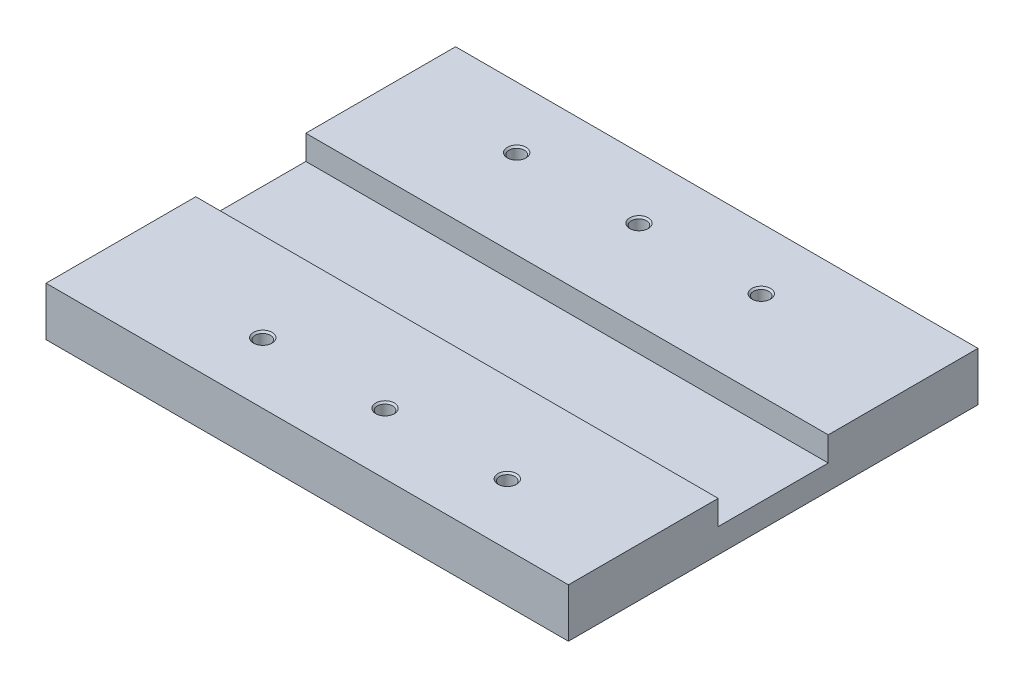
ISO-10303-21;
HEADER;
FILE_DESCRIPTION(('STEP AP214'),'2;1');
FILE_NAME('part.step','',(''),(''),'','','');
FILE_SCHEMA(('AUTOMOTIVE_DESIGN { 1 0 10303 214 1 1 1 1 }'));
ENDSEC;
DATA;
#1=APPLICATION_CONTEXT('core data for automotive mechanical design processes');
#2=APPLICATION_PROTOCOL_DEFINITION('international standard','automotive_design',2000,#1);
#3=PRODUCT_CONTEXT('',#1,'mechanical');
#4=PRODUCT('Part','Part','',(#3));
#5=PRODUCT_RELATED_PRODUCT_CATEGORY('part','',(#4));
#6=PRODUCT_DEFINITION_FORMATION('','',#4);
#7=PRODUCT_DEFINITION_CONTEXT('part definition',#1,'design');
#8=PRODUCT_DEFINITION('design','',#6,#7);
#9=PRODUCT_DEFINITION_SHAPE('','',#8);
#10=(LENGTH_UNIT() NAMED_UNIT(*) SI_UNIT(.MILLI.,.METRE.));
#11=(NAMED_UNIT(*) PLANE_ANGLE_UNIT() SI_UNIT($,.RADIAN.));
#12=(NAMED_UNIT(*) SI_UNIT($,.STERADIAN.) SOLID_ANGLE_UNIT());
#13=UNCERTAINTY_MEASURE_WITH_UNIT(LENGTH_MEASURE(1.E-05),#10,'distance_accuracy_value','');
#14=(GEOMETRIC_REPRESENTATION_CONTEXT(3) GLOBAL_UNCERTAINTY_ASSIGNED_CONTEXT((#13)) GLOBAL_UNIT_ASSIGNED_CONTEXT((#10,
#11,#12)) REPRESENTATION_CONTEXT('',''));
#15=CARTESIAN_POINT('',(0.,0.,0.));
#16=DIRECTION('',(0.,0.,1.));
#17=DIRECTION('',(1.,0.,0.));
#18=AXIS2_PLACEMENT_3D('',#15,#16,#17);
#19=CARTESIAN_POINT('',(104.54,12.,-153.432212943892));
#20=DIRECTION('',(1.,0.,0.));
#21=DIRECTION('',(0.,0.,-1.));
#22=AXIS2_PLACEMENT_3D('',#19,#20,#21);
#23=PLANE('',#22);
#24=DIRECTION('',(0.,0.,-1.));
#25=VECTOR('',#24,1.);
#26=CARTESIAN_POINT('',(104.54,4.,-153.432212943892));
#27=LINE('',#26,#25);
#28=CARTESIAN_POINT('',(104.54,4.,-86.4322129438916));
#29=VERTEX_POINT('',#28);
#30=CARTESIAN_POINT('',(104.54,4.,-153.432212943892));
#31=VERTEX_POINT('',#30);
#32=EDGE_CURVE('E51',#29,#31,#27,.T.);
#33=ORIENTED_EDGE('',*,*,#32,.F.);
#34=DIRECTION('',(0.,-1.,0.));
#35=VECTOR('',#34,1.);
#36=CARTESIAN_POINT('',(104.54,12.,-86.4322129438916));
#37=LINE('',#36,#35);
#38=CARTESIAN_POINT('',(104.54,12.,-86.4322129438916));
#39=VERTEX_POINT('',#38);
#40=EDGE_CURVE('E11',#39,#29,#37,.T.);
#41=ORIENTED_EDGE('',*,*,#40,.F.);
#42=DIRECTION('',(0.,0.,1.));
#43=VECTOR('',#42,1.);
#44=CARTESIAN_POINT('',(104.54,12.,-153.432212943892));
#45=LINE('',#44,#43);
#46=CARTESIAN_POINT('',(104.54,12.,-110.932212943892));
#47=VERTEX_POINT('',#46);
#48=EDGE_CURVE('E137',#47,#39,#45,.T.);
#49=ORIENTED_EDGE('',*,*,#48,.F.);
#50=DIRECTION('',(0.,-1.,0.));
#51=VECTOR('',#50,1.);
#52=CARTESIAN_POINT('',(104.54,12.,-110.932212943892));
#53=LINE('',#52,#51);
#54=CARTESIAN_POINT('',(104.54,8.,-110.932212943892));
#55=VERTEX_POINT('',#54);
#56=EDGE_CURVE('E148',#47,#55,#53,.T.);
#57=ORIENTED_EDGE('',*,*,#56,.T.);
#58=DIRECTION('',(0.,0.,-1.));
#59=VECTOR('',#58,1.);
#60=CARTESIAN_POINT('',(104.54,8.,-110.932212943892));
#61=LINE('',#60,#59);
#62=CARTESIAN_POINT('',(104.54,8.,-128.932212943892));
#63=VERTEX_POINT('',#62);
#64=EDGE_CURVE('E158',#55,#63,#61,.T.);
#65=ORIENTED_EDGE('',*,*,#64,.T.);
#66=DIRECTION('',(0.,1.,0.));
#67=VECTOR('',#66,1.);
#68=CARTESIAN_POINT('',(104.54,12.,-128.932212943892));
#69=LINE('',#68,#67);
#70=CARTESIAN_POINT('',(104.54,12.,-128.932212943892));
#71=VERTEX_POINT('',#70);
#72=EDGE_CURVE('E141',#63,#71,#69,.T.);
#73=ORIENTED_EDGE('',*,*,#72,.T.);
#74=CARTESIAN_POINT('',(104.54,12.,-153.432212943892));
#75=VERTEX_POINT('',#74);
#76=EDGE_CURVE('E134',#75,#71,#45,.T.);
#77=ORIENTED_EDGE('',*,*,#76,.F.);
#78=DIRECTION('',(0.,-1.,0.));
#79=VECTOR('',#78,1.);
#80=CARTESIAN_POINT('',(104.54,12.,-153.432212943892));
#81=LINE('',#80,#79);
#82=EDGE_CURVE('E122',#75,#31,#81,.T.);
#83=ORIENTED_EDGE('',*,*,#82,.T.);
#84=EDGE_LOOP('',(#33,#41,#49,#57,#65,#73,#77,#83));
#85=FACE_BOUND('',#84,.T.);
#86=ADVANCED_FACE('F36',(#85),#23,.F.);
#87=CARTESIAN_POINT('',(104.54,12.,-86.4322129438916));
#88=DIRECTION('',(0.,0.,-1.));
#89=DIRECTION('',(-1.,0.,0.));
#90=AXIS2_PLACEMENT_3D('',#87,#88,#89);
#91=PLANE('',#90);
#92=DIRECTION('',(-1.,0.,0.));
#93=VECTOR('',#92,1.);
#94=CARTESIAN_POINT('',(104.54,4.,-86.4322129438916));
#95=LINE('',#94,#93);
#96=CARTESIAN_POINT('',(190.,4.,-86.4322129438916));
#97=VERTEX_POINT('',#96);
#98=EDGE_CURVE('E118',#97,#29,#95,.T.);
#99=ORIENTED_EDGE('',*,*,#98,.F.);
#100=DIRECTION('',(0.,-1.,0.));
#101=VECTOR('',#100,1.);
#102=CARTESIAN_POINT('',(190.,12.,-86.4322129438916));
#103=LINE('',#102,#101);
#104=CARTESIAN_POINT('',(190.,12.,-86.4322129438916));
#105=VERTEX_POINT('',#104);
#106=EDGE_CURVE('E44',#105,#97,#103,.T.);
#107=ORIENTED_EDGE('',*,*,#106,.F.);
#108=DIRECTION('',(1.,0.,0.));
#109=VECTOR('',#108,1.);
#110=CARTESIAN_POINT('',(104.54,12.,-86.4322129438916));
#111=LINE('',#110,#109);
#112=EDGE_CURVE('E132',#39,#105,#111,.T.);
#113=ORIENTED_EDGE('',*,*,#112,.F.);
#114=ORIENTED_EDGE('',*,*,#40,.T.);
#115=EDGE_LOOP('',(#99,#107,#113,#114));
#116=FACE_BOUND('',#115,.T.);
#117=ADVANCED_FACE('F238',(#116),#91,.F.);
#118=CARTESIAN_POINT('',(190.,12.,-86.4322129438916));
#119=DIRECTION('',(-1.,0.,0.));
#120=DIRECTION('',(0.,0.,1.));
#121=AXIS2_PLACEMENT_3D('',#118,#119,#120);
#122=PLANE('',#121);
#123=DIRECTION('',(0.,0.,1.));
#124=VECTOR('',#123,1.);
#125=CARTESIAN_POINT('',(190.,4.,-86.4322129438916));
#126=LINE('',#125,#124);
#127=CARTESIAN_POINT('',(190.,4.,-153.432212943892));
#128=VERTEX_POINT('',#127);
#129=EDGE_CURVE('E101',#128,#97,#126,.T.);
#130=ORIENTED_EDGE('',*,*,#129,.F.);
#131=DIRECTION('',(0.,-1.,0.));
#132=VECTOR('',#131,1.);
#133=CARTESIAN_POINT('',(190.,12.,-153.432212943892));
#134=LINE('',#133,#132);
#135=CARTESIAN_POINT('',(190.,12.,-153.432212943892));
#136=VERTEX_POINT('',#135);
#137=EDGE_CURVE('E114',#136,#128,#134,.T.);
#138=ORIENTED_EDGE('',*,*,#137,.F.);
#139=DIRECTION('',(0.,0.,-1.));
#140=VECTOR('',#139,1.);
#141=CARTESIAN_POINT('',(190.,12.,-86.4322129438916));
#142=LINE('',#141,#140);
#143=CARTESIAN_POINT('',(190.,12.,-128.932212943892));
#144=VERTEX_POINT('',#143);
#145=EDGE_CURVE('E131',#144,#136,#142,.T.);
#146=ORIENTED_EDGE('',*,*,#145,.F.);
#147=DIRECTION('',(0.,1.,0.));
#148=VECTOR('',#147,1.);
#149=CARTESIAN_POINT('',(190.,12.,-128.932212943892));
#150=LINE('',#149,#148);
#151=CARTESIAN_POINT('',(190.,8.,-128.932212943892));
#152=VERTEX_POINT('',#151);
#153=EDGE_CURVE('E59',#152,#144,#150,.T.);
#154=ORIENTED_EDGE('',*,*,#153,.F.);
#155=DIRECTION('',(0.,0.,-1.));
#156=VECTOR('',#155,1.);
#157=CARTESIAN_POINT('',(190.,8.,-110.932212943892));
#158=LINE('',#157,#156);
#159=CARTESIAN_POINT('',(190.,8.,-110.932212943892));
#160=VERTEX_POINT('',#159);
#161=EDGE_CURVE('E149',#160,#152,#158,.T.);
#162=ORIENTED_EDGE('',*,*,#161,.F.);
#163=DIRECTION('',(0.,-1.,0.));
#164=VECTOR('',#163,1.);
#165=CARTESIAN_POINT('',(190.,12.,-110.932212943892));
#166=LINE('',#165,#164);
#167=CARTESIAN_POINT('',(190.,12.,-110.932212943892));
#168=VERTEX_POINT('',#167);
#169=EDGE_CURVE('E152',#168,#160,#166,.T.);
#170=ORIENTED_EDGE('',*,*,#169,.F.);
#171=EDGE_CURVE('E128',#105,#168,#142,.T.);
#172=ORIENTED_EDGE('',*,*,#171,.F.);
#173=ORIENTED_EDGE('',*,*,#106,.T.);
#174=EDGE_LOOP('',(#130,#138,#146,#154,#162,#170,#172,#173));
#175=FACE_BOUND('',#174,.T.);
#176=ADVANCED_FACE('F112',(#175),#122,.F.);
#177=CARTESIAN_POINT('',(190.,12.,-153.432212943892));
#178=DIRECTION('',(0.,0.,1.));
#179=DIRECTION('',(1.,0.,0.));
#180=AXIS2_PLACEMENT_3D('',#177,#178,#179);
#181=PLANE('',#180);
#182=DIRECTION('',(1.,0.,0.));
#183=VECTOR('',#182,1.);
#184=CARTESIAN_POINT('',(190.,4.,-153.432212943892));
#185=LINE('',#184,#183);
#186=EDGE_CURVE('E98',#31,#128,#185,.T.);
#187=ORIENTED_EDGE('',*,*,#186,.F.);
#188=ORIENTED_EDGE('',*,*,#82,.F.);
#189=DIRECTION('',(-1.,0.,0.));
#190=VECTOR('',#189,1.);
#191=CARTESIAN_POINT('',(190.,12.,-153.432212943892));
#192=LINE('',#191,#190);
#193=EDGE_CURVE('E121',#136,#75,#192,.T.);
#194=ORIENTED_EDGE('',*,*,#193,.F.);
#195=ORIENTED_EDGE('',*,*,#137,.T.);
#196=EDGE_LOOP('',(#187,#188,#194,#195));
#197=FACE_BOUND('',#196,.T.);
#198=ADVANCED_FACE('F120',(#197),#181,.F.);
#199=CARTESIAN_POINT('',(124.54,12.,-143.432212943892));
#200=DIRECTION('',(0.,1.,0.));
#201=DIRECTION('',(0.,0.,1.));
#202=AXIS2_PLACEMENT_3D('',#199,#200,#201);
#203=CYLINDRICAL_SURFACE('',#202,1.25);
#204=CARTESIAN_POINT('',(124.54,11.725,-143.432212943892));
#205=DIRECTION('',(0.,1.,0.));
#206=DIRECTION('',(0.,0.,1.));
#207=AXIS2_PLACEMENT_3D('',#204,#205,#206);
#208=CIRCLE('',#207,1.25);
#209=CARTESIAN_POINT('',(124.54,11.725,-142.182212943892));
#210=VERTEX_POINT('',#209);
#211=EDGE_CURVE('E155',#210,#210,#208,.T.);
#212=ORIENTED_EDGE('',*,*,#211,.T.);
#213=EDGE_LOOP('',(#212));
#214=FACE_BOUND('',#213,.T.);
#215=CARTESIAN_POINT('',(124.54,4.,-143.432212943892));
#216=DIRECTION('',(0.,-1.,0.));
#217=DIRECTION('',(0.,0.,-1.));
#218=AXIS2_PLACEMENT_3D('',#215,#216,#217);
#219=CIRCLE('',#218,1.25);
#220=CARTESIAN_POINT('',(124.54,4.,-144.682212943892));
#221=VERTEX_POINT('',#220);
#222=EDGE_CURVE('E107',#221,#221,#219,.F.);
#223=ORIENTED_EDGE('',*,*,#222,.F.);
#224=EDGE_LOOP('',(#223));
#225=FACE_BOUND('',#224,.T.);
#226=ADVANCED_FACE('F272',(#214,#225),#203,.F.);
#227=CARTESIAN_POINT('',(144.54,12.,-143.432212943892));
#228=DIRECTION('',(0.,1.,0.));
#229=DIRECTION('',(0.,0.,1.));
#230=AXIS2_PLACEMENT_3D('',#227,#228,#229);
#231=CYLINDRICAL_SURFACE('',#230,1.25);
#232=CARTESIAN_POINT('',(144.54,11.725,-143.432212943892));
#233=DIRECTION('',(0.,1.,0.));
#234=DIRECTION('',(0.,0.,1.));
#235=AXIS2_PLACEMENT_3D('',#232,#233,#234);
#236=CIRCLE('',#235,1.25);
#237=CARTESIAN_POINT('',(144.54,11.725,-142.182212943892));
#238=VERTEX_POINT('',#237);
#239=EDGE_CURVE('E168',#238,#238,#236,.T.);
#240=ORIENTED_EDGE('',*,*,#239,.T.);
#241=EDGE_LOOP('',(#240));
#242=FACE_BOUND('',#241,.T.);
#243=CARTESIAN_POINT('',(144.54,4.,-143.432212943892));
#244=DIRECTION('',(0.,-1.,0.));
#245=DIRECTION('',(0.,0.,-1.));
#246=AXIS2_PLACEMENT_3D('',#243,#244,#245);
#247=CIRCLE('',#246,1.25);
#248=CARTESIAN_POINT('',(144.54,4.,-144.682212943892));
#249=VERTEX_POINT('',#248);
#250=EDGE_CURVE('E202',#249,#249,#247,.F.);
#251=ORIENTED_EDGE('',*,*,#250,.F.);
#252=EDGE_LOOP('',(#251));
#253=FACE_BOUND('',#252,.T.);
#254=ADVANCED_FACE('F288',(#242,#253),#231,.F.);
#255=CARTESIAN_POINT('',(164.54,12.,-143.432212943892));
#256=DIRECTION('',(0.,1.,0.));
#257=DIRECTION('',(0.,0.,1.));
#258=AXIS2_PLACEMENT_3D('',#255,#256,#257);
#259=CYLINDRICAL_SURFACE('',#258,1.25);
#260=CARTESIAN_POINT('',(164.54,11.725,-143.432212943892));
#261=DIRECTION('',(0.,1.,0.));
#262=DIRECTION('',(0.,0.,1.));
#263=AXIS2_PLACEMENT_3D('',#260,#261,#262);
#264=CIRCLE('',#263,1.25);
#265=CARTESIAN_POINT('',(164.54,11.725,-142.182212943892));
#266=VERTEX_POINT('',#265);
#267=EDGE_CURVE('E174',#266,#266,#264,.T.);
#268=ORIENTED_EDGE('',*,*,#267,.T.);
#269=EDGE_LOOP('',(#268));
#270=FACE_BOUND('',#269,.T.);
#271=CARTESIAN_POINT('',(164.54,4.,-143.432212943892));
#272=DIRECTION('',(0.,-1.,0.));
#273=DIRECTION('',(0.,0.,-1.));
#274=AXIS2_PLACEMENT_3D('',#271,#272,#273);
#275=CIRCLE('',#274,1.25);
#276=CARTESIAN_POINT('',(164.54,4.,-144.682212943892));
#277=VERTEX_POINT('',#276);
#278=EDGE_CURVE('E205',#277,#277,#275,.F.);
#279=ORIENTED_EDGE('',*,*,#278,.F.);
#280=EDGE_LOOP('',(#279));
#281=FACE_BOUND('',#280,.T.);
#282=ADVANCED_FACE('F296',(#270,#281),#259,.F.);
#283=CARTESIAN_POINT('',(130.,12.,-96.4322129438916));
#284=DIRECTION('',(0.,1.,0.));
#285=DIRECTION('',(0.,0.,1.));
#286=AXIS2_PLACEMENT_3D('',#283,#284,#285);
#287=CYLINDRICAL_SURFACE('',#286,1.25);
#288=CARTESIAN_POINT('',(130.,11.725,-96.4322129438916));
#289=DIRECTION('',(0.,1.,0.));
#290=DIRECTION('',(0.,0.,1.));
#291=AXIS2_PLACEMENT_3D('',#288,#289,#290);
#292=CIRCLE('',#291,1.25);
#293=CARTESIAN_POINT('',(130.,11.725,-95.1822129438916));
#294=VERTEX_POINT('',#293);
#295=EDGE_CURVE('E180',#294,#294,#292,.T.);
#296=ORIENTED_EDGE('',*,*,#295,.T.);
#297=EDGE_LOOP('',(#296));
#298=FACE_BOUND('',#297,.T.);
#299=CARTESIAN_POINT('',(130.,4.,-96.4322129438916));
#300=DIRECTION('',(0.,-1.,0.));
#301=DIRECTION('',(0.,0.,-1.));
#302=AXIS2_PLACEMENT_3D('',#299,#300,#301);
#303=CIRCLE('',#302,1.25);
#304=CARTESIAN_POINT('',(130.,4.,-97.6822129438916));
#305=VERTEX_POINT('',#304);
#306=EDGE_CURVE('E208',#305,#305,#303,.F.);
#307=ORIENTED_EDGE('',*,*,#306,.F.);
#308=EDGE_LOOP('',(#307));
#309=FACE_BOUND('',#308,.T.);
#310=ADVANCED_FACE('F232',(#298,#309),#287,.F.);
#311=CARTESIAN_POINT('',(150.,12.,-96.4322129438916));
#312=DIRECTION('',(0.,1.,0.));
#313=DIRECTION('',(0.,0.,1.));
#314=AXIS2_PLACEMENT_3D('',#311,#312,#313);
#315=CYLINDRICAL_SURFACE('',#314,1.25);
#316=CARTESIAN_POINT('',(150.,11.725,-96.4322129438916));
#317=DIRECTION('',(0.,1.,0.));
#318=DIRECTION('',(0.,0.,1.));
#319=AXIS2_PLACEMENT_3D('',#316,#317,#318);
#320=CIRCLE('',#319,1.25);
#321=CARTESIAN_POINT('',(150.,11.725,-95.1822129438916));
#322=VERTEX_POINT('',#321);
#323=EDGE_CURVE('E186',#322,#322,#320,.T.);
#324=ORIENTED_EDGE('',*,*,#323,.T.);
#325=EDGE_LOOP('',(#324));
#326=FACE_BOUND('',#325,.T.);
#327=CARTESIAN_POINT('',(150.,4.,-96.4322129438916));
#328=DIRECTION('',(0.,-1.,0.));
#329=DIRECTION('',(0.,0.,-1.));
#330=AXIS2_PLACEMENT_3D('',#327,#328,#329);
#331=CIRCLE('',#330,1.25);
#332=CARTESIAN_POINT('',(150.,4.,-97.6822129438916));
#333=VERTEX_POINT('',#332);
#334=EDGE_CURVE('E211',#333,#333,#331,.F.);
#335=ORIENTED_EDGE('',*,*,#334,.F.);
#336=EDGE_LOOP('',(#335));
#337=FACE_BOUND('',#336,.T.);
#338=ADVANCED_FACE('F222',(#326,#337),#315,.F.);
#339=CARTESIAN_POINT('',(170.,12.,-96.4322129438916));
#340=DIRECTION('',(0.,1.,0.));
#341=DIRECTION('',(0.,0.,1.));
#342=AXIS2_PLACEMENT_3D('',#339,#340,#341);
#343=CYLINDRICAL_SURFACE('',#342,1.25);
#344=CARTESIAN_POINT('',(170.,11.725,-96.4322129438916));
#345=DIRECTION('',(0.,1.,0.));
#346=DIRECTION('',(0.,0.,1.));
#347=AXIS2_PLACEMENT_3D('',#344,#345,#346);
#348=CIRCLE('',#347,1.25);
#349=CARTESIAN_POINT('',(170.,11.725,-95.1822129438916));
#350=VERTEX_POINT('',#349);
#351=EDGE_CURVE('E192',#350,#350,#348,.T.);
#352=ORIENTED_EDGE('',*,*,#351,.T.);
#353=EDGE_LOOP('',(#352));
#354=FACE_BOUND('',#353,.T.);
#355=CARTESIAN_POINT('',(170.,4.,-96.4322129438916));
#356=DIRECTION('',(0.,-1.,0.));
#357=DIRECTION('',(0.,0.,-1.));
#358=AXIS2_PLACEMENT_3D('',#355,#356,#357);
#359=CIRCLE('',#358,1.25);
#360=CARTESIAN_POINT('',(170.,4.,-97.6822129438916));
#361=VERTEX_POINT('',#360);
#362=EDGE_CURVE('E39',#361,#361,#359,.F.);
#363=ORIENTED_EDGE('',*,*,#362,.F.);
#364=EDGE_LOOP('',(#363));
#365=FACE_BOUND('',#364,.T.);
#366=ADVANCED_FACE('F219',(#354,#365),#343,.F.);
#367=CARTESIAN_POINT('',(0.,12.,0.));
#368=DIRECTION('',(0.,1.,0.));
#369=DIRECTION('',(0.,0.,1.));
#370=AXIS2_PLACEMENT_3D('',#367,#368,#369);
#371=PLANE('',#370);
#372=CARTESIAN_POINT('',(170.,12.,-96.4322129438916));
#373=DIRECTION('',(0.,1.,0.));
#374=DIRECTION('',(0.,0.,1.));
#375=AXIS2_PLACEMENT_3D('',#372,#373,#374);
#376=CIRCLE('',#375,1.525);
#377=CARTESIAN_POINT('',(170.,12.,-94.9072129438916));
#378=VERTEX_POINT('',#377);
#379=EDGE_CURVE('E195',#378,#378,#376,.T.);
#380=ORIENTED_EDGE('',*,*,#379,.F.);
#381=EDGE_LOOP('',(#380));
#382=FACE_BOUND('',#381,.T.);
#383=CARTESIAN_POINT('',(150.,12.,-96.4322129438916));
#384=DIRECTION('',(0.,1.,0.));
#385=DIRECTION('',(0.,0.,1.));
#386=AXIS2_PLACEMENT_3D('',#383,#384,#385);
#387=CIRCLE('',#386,1.525);
#388=CARTESIAN_POINT('',(150.,12.,-94.9072129438916));
#389=VERTEX_POINT('',#388);
#390=EDGE_CURVE('E189',#389,#389,#387,.T.);
#391=ORIENTED_EDGE('',*,*,#390,.F.);
#392=EDGE_LOOP('',(#391));
#393=FACE_BOUND('',#392,.T.);
#394=CARTESIAN_POINT('',(130.,12.,-96.4322129438916));
#395=DIRECTION('',(0.,1.,0.));
#396=DIRECTION('',(0.,0.,1.));
#397=AXIS2_PLACEMENT_3D('',#394,#395,#396);
#398=CIRCLE('',#397,1.525);
#399=CARTESIAN_POINT('',(130.,12.,-94.9072129438916));
#400=VERTEX_POINT('',#399);
#401=EDGE_CURVE('E183',#400,#400,#398,.T.);
#402=ORIENTED_EDGE('',*,*,#401,.F.);
#403=EDGE_LOOP('',(#402));
#404=FACE_BOUND('',#403,.T.);
#405=DIRECTION('',(1.,0.,0.));
#406=VECTOR('',#405,1.);
#407=CARTESIAN_POINT('',(104.54,12.,-110.932212943892));
#408=LINE('',#407,#406);
#409=EDGE_CURVE('E145',#47,#168,#408,.T.);
#410=ORIENTED_EDGE('',*,*,#409,.F.);
#411=ORIENTED_EDGE('',*,*,#48,.T.);
#412=ORIENTED_EDGE('',*,*,#112,.T.);
#413=ORIENTED_EDGE('',*,*,#171,.T.);
#414=EDGE_LOOP('',(#410,#411,#412,#413));
#415=FACE_BOUND('',#414,.T.);
#416=ADVANCED_FACE('F221',(#382,#393,#404,#415),#371,.T.);
#417=CARTESIAN_POINT('',(164.54,12.,-143.432212943892));
#418=DIRECTION('',(0.,1.,0.));
#419=DIRECTION('',(0.,0.,1.));
#420=AXIS2_PLACEMENT_3D('',#417,#418,#419);
#421=CIRCLE('',#420,1.525);
#422=CARTESIAN_POINT('',(164.54,12.,-141.907212943892));
#423=VERTEX_POINT('',#422);
#424=EDGE_CURVE('E177',#423,#423,#421,.T.);
#425=ORIENTED_EDGE('',*,*,#424,.F.);
#426=EDGE_LOOP('',(#425));
#427=FACE_BOUND('',#426,.T.);
#428=CARTESIAN_POINT('',(144.54,12.,-143.432212943892));
#429=DIRECTION('',(0.,1.,0.));
#430=DIRECTION('',(0.,0.,1.));
#431=AXIS2_PLACEMENT_3D('',#428,#429,#430);
#432=CIRCLE('',#431,1.525);
#433=CARTESIAN_POINT('',(144.54,12.,-141.907212943892));
#434=VERTEX_POINT('',#433);
#435=EDGE_CURVE('E171',#434,#434,#432,.T.);
#436=ORIENTED_EDGE('',*,*,#435,.F.);
#437=EDGE_LOOP('',(#436));
#438=FACE_BOUND('',#437,.T.);
#439=CARTESIAN_POINT('',(124.54,12.,-143.432212943892));
#440=DIRECTION('',(0.,1.,0.));
#441=DIRECTION('',(0.,0.,1.));
#442=AXIS2_PLACEMENT_3D('',#439,#440,#441);
#443=CIRCLE('',#442,1.525);
#444=CARTESIAN_POINT('',(124.54,12.,-141.907212943892));
#445=VERTEX_POINT('',#444);
#446=EDGE_CURVE('E165',#445,#445,#443,.T.);
#447=ORIENTED_EDGE('',*,*,#446,.F.);
#448=EDGE_LOOP('',(#447));
#449=FACE_BOUND('',#448,.T.);
#450=DIRECTION('',(1.,0.,0.));
#451=VECTOR('',#450,1.);
#452=CARTESIAN_POINT('',(104.54,12.,-128.932212943892));
#453=LINE('',#452,#451);
#454=EDGE_CURVE('E143',#71,#144,#453,.T.);
#455=ORIENTED_EDGE('',*,*,#454,.T.);
#456=ORIENTED_EDGE('',*,*,#145,.T.);
#457=ORIENTED_EDGE('',*,*,#193,.T.);
#458=ORIENTED_EDGE('',*,*,#76,.T.);
#459=EDGE_LOOP('',(#455,#456,#457,#458));
#460=FACE_BOUND('',#459,.T.);
#461=ADVANCED_FACE('F229',(#427,#438,#449,#460),#371,.T.);
#462=CARTESIAN_POINT('',(104.54,12.,-110.932212943892));
#463=DIRECTION('',(0.,0.,1.));
#464=DIRECTION('',(0.,-1.,0.));
#465=AXIS2_PLACEMENT_3D('',#462,#463,#464);
#466=PLANE('',#465);
#467=ORIENTED_EDGE('',*,*,#169,.T.);
#468=DIRECTION('',(1.,0.,0.));
#469=VECTOR('',#468,1.);
#470=CARTESIAN_POINT('',(104.54,8.,-110.932212943892));
#471=LINE('',#470,#469);
#472=EDGE_CURVE('E138',#55,#160,#471,.T.);
#473=ORIENTED_EDGE('',*,*,#472,.F.);
#474=ORIENTED_EDGE('',*,*,#56,.F.);
#475=ORIENTED_EDGE('',*,*,#409,.T.);
#476=EDGE_LOOP('',(#467,#473,#474,#475));
#477=FACE_BOUND('',#476,.T.);
#478=ADVANCED_FACE('F252',(#477),#466,.F.);
#479=CARTESIAN_POINT('',(104.54,12.,-128.932212943892));
#480=DIRECTION('',(0.,0.,-1.));
#481=DIRECTION('',(-1.,0.,0.));
#482=AXIS2_PLACEMENT_3D('',#479,#480,#481);
#483=PLANE('',#482);
#484=ORIENTED_EDGE('',*,*,#153,.T.);
#485=ORIENTED_EDGE('',*,*,#454,.F.);
#486=ORIENTED_EDGE('',*,*,#72,.F.);
#487=DIRECTION('',(1.,0.,0.));
#488=VECTOR('',#487,1.);
#489=CARTESIAN_POINT('',(104.54,8.,-128.932212943892));
#490=LINE('',#489,#488);
#491=EDGE_CURVE('E140',#63,#152,#490,.T.);
#492=ORIENTED_EDGE('',*,*,#491,.T.);
#493=EDGE_LOOP('',(#484,#485,#486,#492));
#494=FACE_BOUND('',#493,.T.);
#495=ADVANCED_FACE('F258',(#494),#483,.F.);
#496=CARTESIAN_POINT('',(104.54,8.,-110.932212943892));
#497=DIRECTION('',(0.,-1.,0.));
#498=DIRECTION('',(0.,0.,-1.));
#499=AXIS2_PLACEMENT_3D('',#496,#497,#498);
#500=PLANE('',#499);
#501=ORIENTED_EDGE('',*,*,#161,.T.);
#502=ORIENTED_EDGE('',*,*,#491,.F.);
#503=ORIENTED_EDGE('',*,*,#64,.F.);
#504=ORIENTED_EDGE('',*,*,#472,.T.);
#505=EDGE_LOOP('',(#501,#502,#503,#504));
#506=FACE_BOUND('',#505,.T.);
#507=ADVANCED_FACE('F256',(#506),#500,.F.);
#508=CARTESIAN_POINT('',(124.54,12.,-143.432212943892));
#509=DIRECTION('',(0.,1.,0.));
#510=DIRECTION('',(0.,0.,1.));
#511=AXIS2_PLACEMENT_3D('',#508,#509,#510);
#512=CONICAL_SURFACE('',#511,1.525,0.785398163397442);
#513=ORIENTED_EDGE('',*,*,#211,.F.);
#514=EDGE_LOOP('',(#513));
#515=FACE_BOUND('',#514,.T.);
#516=ORIENTED_EDGE('',*,*,#446,.T.);
#517=EDGE_LOOP('',(#516));
#518=FACE_BOUND('',#517,.T.);
#519=ADVANCED_FACE('F369',(#515,#518),#512,.F.);
#520=CARTESIAN_POINT('',(144.54,12.,-143.432212943892));
#521=DIRECTION('',(0.,1.,0.));
#522=DIRECTION('',(0.,0.,1.));
#523=AXIS2_PLACEMENT_3D('',#520,#521,#522);
#524=CONICAL_SURFACE('',#523,1.525,0.785398163397442);
#525=ORIENTED_EDGE('',*,*,#239,.F.);
#526=EDGE_LOOP('',(#525));
#527=FACE_BOUND('',#526,.T.);
#528=ORIENTED_EDGE('',*,*,#435,.T.);
#529=EDGE_LOOP('',(#528));
#530=FACE_BOUND('',#529,.T.);
#531=ADVANCED_FACE('F361',(#527,#530),#524,.F.);
#532=CARTESIAN_POINT('',(164.54,12.,-143.432212943892));
#533=DIRECTION('',(0.,1.,0.));
#534=DIRECTION('',(0.,0.,1.));
#535=AXIS2_PLACEMENT_3D('',#532,#533,#534);
#536=CONICAL_SURFACE('',#535,1.525,0.785398163397442);
#537=ORIENTED_EDGE('',*,*,#267,.F.);
#538=EDGE_LOOP('',(#537));
#539=FACE_BOUND('',#538,.T.);
#540=ORIENTED_EDGE('',*,*,#424,.T.);
#541=EDGE_LOOP('',(#540));
#542=FACE_BOUND('',#541,.T.);
#543=ADVANCED_FACE('F353',(#539,#542),#536,.F.);
#544=CARTESIAN_POINT('',(130.,12.,-96.4322129438916));
#545=DIRECTION('',(0.,1.,0.));
#546=DIRECTION('',(0.,0.,1.));
#547=AXIS2_PLACEMENT_3D('',#544,#545,#546);
#548=CONICAL_SURFACE('',#547,1.525,0.785398163397442);
#549=ORIENTED_EDGE('',*,*,#295,.F.);
#550=EDGE_LOOP('',(#549));
#551=FACE_BOUND('',#550,.T.);
#552=ORIENTED_EDGE('',*,*,#401,.T.);
#553=EDGE_LOOP('',(#552));
#554=FACE_BOUND('',#553,.T.);
#555=ADVANCED_FACE('F346',(#551,#554),#548,.F.);
#556=CARTESIAN_POINT('',(150.,12.,-96.4322129438916));
#557=DIRECTION('',(0.,1.,0.));
#558=DIRECTION('',(0.,0.,1.));
#559=AXIS2_PLACEMENT_3D('',#556,#557,#558);
#560=CONICAL_SURFACE('',#559,1.525,0.785398163397442);
#561=ORIENTED_EDGE('',*,*,#323,.F.);
#562=EDGE_LOOP('',(#561));
#563=FACE_BOUND('',#562,.T.);
#564=ORIENTED_EDGE('',*,*,#390,.T.);
#565=EDGE_LOOP('',(#564));
#566=FACE_BOUND('',#565,.T.);
#567=ADVANCED_FACE('F340',(#563,#566),#560,.F.);
#568=CARTESIAN_POINT('',(170.,12.,-96.4322129438916));
#569=DIRECTION('',(0.,1.,0.));
#570=DIRECTION('',(0.,0.,1.));
#571=AXIS2_PLACEMENT_3D('',#568,#569,#570);
#572=CONICAL_SURFACE('',#571,1.525,0.785398163397442);
#573=ORIENTED_EDGE('',*,*,#351,.F.);
#574=EDGE_LOOP('',(#573));
#575=FACE_BOUND('',#574,.T.);
#576=ORIENTED_EDGE('',*,*,#379,.T.);
#577=EDGE_LOOP('',(#576));
#578=FACE_BOUND('',#577,.T.);
#579=ADVANCED_FACE('F329',(#575,#578),#572,.F.);
#580=CARTESIAN_POINT('',(143.291325046903,4.,-124.180575303797));
#581=DIRECTION('',(0.,-1.,0.));
#582=DIRECTION('',(0.,0.,-1.));
#583=AXIS2_PLACEMENT_3D('',#580,#581,#582);
#584=PLANE('',#583);
#585=ORIENTED_EDGE('',*,*,#222,.T.);
#586=EDGE_LOOP('',(#585));
#587=FACE_BOUND('',#586,.T.);
#588=ORIENTED_EDGE('',*,*,#250,.T.);
#589=EDGE_LOOP('',(#588));
#590=FACE_BOUND('',#589,.T.);
#591=ORIENTED_EDGE('',*,*,#278,.T.);
#592=EDGE_LOOP('',(#591));
#593=FACE_BOUND('',#592,.T.);
#594=ORIENTED_EDGE('',*,*,#306,.T.);
#595=EDGE_LOOP('',(#594));
#596=FACE_BOUND('',#595,.T.);
#597=ORIENTED_EDGE('',*,*,#334,.T.);
#598=EDGE_LOOP('',(#597));
#599=FACE_BOUND('',#598,.T.);
#600=ORIENTED_EDGE('',*,*,#362,.T.);
#601=EDGE_LOOP('',(#600));
#602=FACE_BOUND('',#601,.T.);
#603=ORIENTED_EDGE('',*,*,#32,.T.);
#604=ORIENTED_EDGE('',*,*,#186,.T.);
#605=ORIENTED_EDGE('',*,*,#129,.T.);
#606=ORIENTED_EDGE('',*,*,#98,.T.);
#607=EDGE_LOOP('',(#603,#604,#605,#606));
#608=FACE_BOUND('',#607,.T.);
#609=ADVANCED_FACE('F100',(#587,#590,#593,#596,#599,#602,#608),#584,.T.);
#610=CLOSED_SHELL('',(#86,#117,#176,#198,#226,#254,#282,#310,#338,#366,#416,#461,#478,#495,#507,
#519,#531,#543,#555,#567,#579,#609));
#611=MANIFOLD_SOLID_BREP('B2',#610);
#612=ADVANCED_BREP_SHAPE_REPRESENTATION('',(#18,#611),#14);
#613=SHAPE_DEFINITION_REPRESENTATION(#9,#612);
ENDSEC;
END-ISO-10303-21;
